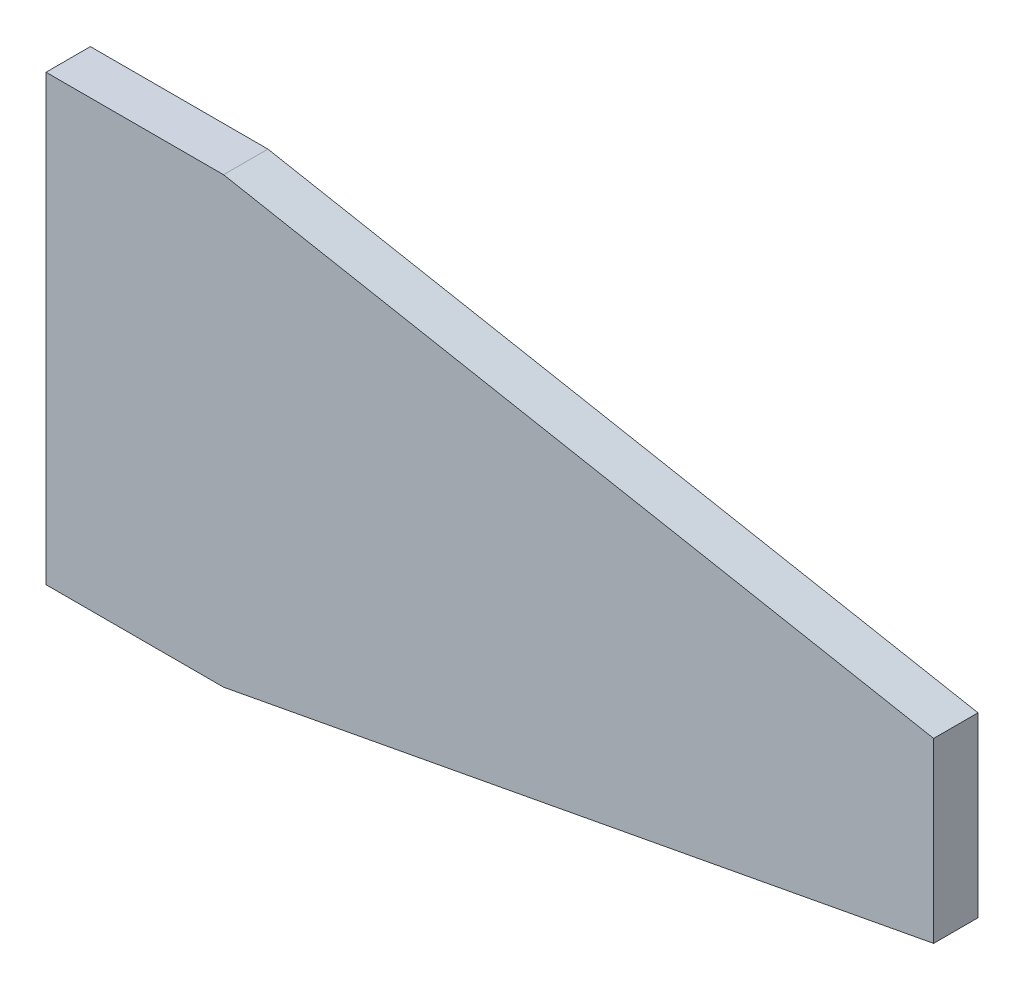
ISO-10303-21;
HEADER;
FILE_DESCRIPTION(('STEP AP214'),'2;1');
FILE_NAME('part.step','',(''),(''),'','','');
FILE_SCHEMA(('AUTOMOTIVE_DESIGN { 1 0 10303 214 1 1 1 1 }'));
ENDSEC;
DATA;
#1=APPLICATION_CONTEXT('core data for automotive mechanical design processes');
#2=APPLICATION_PROTOCOL_DEFINITION('international standard','automotive_design',2000,#1);
#3=PRODUCT_CONTEXT('',#1,'mechanical');
#4=PRODUCT('Part','Part','',(#3));
#5=PRODUCT_RELATED_PRODUCT_CATEGORY('part','',(#4));
#6=PRODUCT_DEFINITION_FORMATION('','',#4);
#7=PRODUCT_DEFINITION_CONTEXT('part definition',#1,'design');
#8=PRODUCT_DEFINITION('design','',#6,#7);
#9=PRODUCT_DEFINITION_SHAPE('','',#8);
#10=(LENGTH_UNIT() NAMED_UNIT(*) SI_UNIT(.MILLI.,.METRE.));
#11=(NAMED_UNIT(*) PLANE_ANGLE_UNIT() SI_UNIT($,.RADIAN.));
#12=(NAMED_UNIT(*) SI_UNIT($,.STERADIAN.) SOLID_ANGLE_UNIT());
#13=UNCERTAINTY_MEASURE_WITH_UNIT(LENGTH_MEASURE(1.E-05),#10,'distance_accuracy_value','');
#14=(GEOMETRIC_REPRESENTATION_CONTEXT(3) GLOBAL_UNCERTAINTY_ASSIGNED_CONTEXT((#13)) GLOBAL_UNIT_ASSIGNED_CONTEXT((#10,
#11,#12)) REPRESENTATION_CONTEXT('',''));
#15=CARTESIAN_POINT('',(0.,0.,0.));
#16=DIRECTION('',(0.,0.,1.));
#17=DIRECTION('',(1.,0.,0.));
#18=AXIS2_PLACEMENT_3D('',#15,#16,#17);
#19=CARTESIAN_POINT('',(200.,-20.,5.));
#20=DIRECTION('',(-1.,0.,0.));
#21=DIRECTION('',(0.,0.,1.));
#22=AXIS2_PLACEMENT_3D('',#19,#20,#21);
#23=PLANE('',#22);
#24=DIRECTION('',(0.,1.,0.));
#25=VECTOR('',#24,1.);
#26=CARTESIAN_POINT('',(200.,-20.,-5.));
#27=LINE('',#26,#25);
#28=CARTESIAN_POINT('',(200.,-20.,-5.));
#29=VERTEX_POINT('',#28);
#30=CARTESIAN_POINT('',(200.,20.,-5.));
#31=VERTEX_POINT('',#30);
#32=EDGE_CURVE('E121',#29,#31,#27,.T.);
#33=ORIENTED_EDGE('',*,*,#32,.T.);
#34=DIRECTION('',(0.,0.,-1.));
#35=VECTOR('',#34,1.);
#36=CARTESIAN_POINT('',(200.,20.,5.));
#37=LINE('',#36,#35);
#38=CARTESIAN_POINT('',(200.,20.,5.));
#39=VERTEX_POINT('',#38);
#40=EDGE_CURVE('E11',#39,#31,#37,.T.);
#41=ORIENTED_EDGE('',*,*,#40,.F.);
#42=DIRECTION('',(0.,1.,0.));
#43=VECTOR('',#42,1.);
#44=CARTESIAN_POINT('',(200.,-20.,5.));
#45=LINE('',#44,#43);
#46=CARTESIAN_POINT('',(200.,-20.,5.));
#47=VERTEX_POINT('',#46);
#48=EDGE_CURVE('E131',#47,#39,#45,.T.);
#49=ORIENTED_EDGE('',*,*,#48,.F.);
#50=DIRECTION('',(0.,0.,-1.));
#51=VECTOR('',#50,1.);
#52=CARTESIAN_POINT('',(200.,-20.,5.));
#53=LINE('',#52,#51);
#54=EDGE_CURVE('E117',#47,#29,#53,.T.);
#55=ORIENTED_EDGE('',*,*,#54,.T.);
#56=EDGE_LOOP('',(#33,#41,#49,#55));
#57=FACE_BOUND('',#56,.T.);
#58=ADVANCED_FACE('F37',(#57),#23,.F.);
#59=CARTESIAN_POINT('',(200.,20.,5.));
#60=DIRECTION('',(-0.184288535050185,-0.982872186934322,0.));
#61=DIRECTION('',(0.982872186934322,-0.184288535050185,0.));
#62=AXIS2_PLACEMENT_3D('',#59,#60,#61);
#63=PLANE('',#62);
#64=DIRECTION('',(-0.982872186934322,0.184288535050185,0.));
#65=VECTOR('',#64,1.);
#66=CARTESIAN_POINT('',(200.,20.,-5.));
#67=LINE('',#66,#65);
#68=CARTESIAN_POINT('',(40.,50.,-5.));
#69=VERTEX_POINT('',#68);
#70=EDGE_CURVE('E124',#31,#69,#67,.T.);
#71=ORIENTED_EDGE('',*,*,#70,.T.);
#72=DIRECTION('',(0.,0.,-1.));
#73=VECTOR('',#72,1.);
#74=CARTESIAN_POINT('',(40.,50.,5.));
#75=LINE('',#74,#73);
#76=CARTESIAN_POINT('',(40.,50.,5.));
#77=VERTEX_POINT('',#76);
#78=EDGE_CURVE('E45',#77,#69,#75,.T.);
#79=ORIENTED_EDGE('',*,*,#78,.F.);
#80=DIRECTION('',(-0.982872186934322,0.184288535050185,0.));
#81=VECTOR('',#80,1.);
#82=CARTESIAN_POINT('',(200.,20.,5.));
#83=LINE('',#82,#81);
#84=EDGE_CURVE('E90',#39,#77,#83,.T.);
#85=ORIENTED_EDGE('',*,*,#84,.F.);
#86=ORIENTED_EDGE('',*,*,#40,.T.);
#87=EDGE_LOOP('',(#71,#79,#85,#86));
#88=FACE_BOUND('',#87,.T.);
#89=ADVANCED_FACE('F155',(#88),#63,.F.);
#90=CARTESIAN_POINT('',(40.,50.,5.));
#91=DIRECTION('',(0.,-1.,0.));
#92=DIRECTION('',(1.,0.,0.));
#93=AXIS2_PLACEMENT_3D('',#90,#91,#92);
#94=PLANE('',#93);
#95=DIRECTION('',(-1.,0.,0.));
#96=VECTOR('',#95,1.);
#97=CARTESIAN_POINT('',(40.,50.,-5.));
#98=LINE('',#97,#96);
#99=CARTESIAN_POINT('',(0.,50.,-5.));
#100=VERTEX_POINT('',#99);
#101=EDGE_CURVE('E126',#69,#100,#98,.T.);
#102=ORIENTED_EDGE('',*,*,#101,.T.);
#103=DIRECTION('',(0.,0.,-1.));
#104=VECTOR('',#103,1.);
#105=CARTESIAN_POINT('',(0.,50.,5.));
#106=LINE('',#105,#104);
#107=CARTESIAN_POINT('',(0.,50.,5.));
#108=VERTEX_POINT('',#107);
#109=EDGE_CURVE('E112',#108,#100,#106,.T.);
#110=ORIENTED_EDGE('',*,*,#109,.F.);
#111=DIRECTION('',(-1.,0.,0.));
#112=VECTOR('',#111,1.);
#113=CARTESIAN_POINT('',(40.,50.,5.));
#114=LINE('',#113,#112);
#115=EDGE_CURVE('E103',#77,#108,#114,.T.);
#116=ORIENTED_EDGE('',*,*,#115,.F.);
#117=ORIENTED_EDGE('',*,*,#78,.T.);
#118=EDGE_LOOP('',(#102,#110,#116,#117));
#119=FACE_BOUND('',#118,.T.);
#120=ADVANCED_FACE('F137',(#119),#94,.F.);
#121=CARTESIAN_POINT('',(0.,50.,5.));
#122=DIRECTION('',(1.,0.,0.));
#123=DIRECTION('',(0.,0.,-1.));
#124=AXIS2_PLACEMENT_3D('',#121,#122,#123);
#125=PLANE('',#124);
#126=DIRECTION('',(0.,-1.,0.));
#127=VECTOR('',#126,1.);
#128=CARTESIAN_POINT('',(0.,50.,-5.));
#129=LINE('',#128,#127);
#130=CARTESIAN_POINT('',(0.,-50.,-5.));
#131=VERTEX_POINT('',#130);
#132=EDGE_CURVE('E111',#100,#131,#129,.T.);
#133=ORIENTED_EDGE('',*,*,#132,.T.);
#134=DIRECTION('',(0.,0.,-1.));
#135=VECTOR('',#134,1.);
#136=CARTESIAN_POINT('',(0.,-50.,5.));
#137=LINE('',#136,#135);
#138=CARTESIAN_POINT('',(0.,-50.,5.));
#139=VERTEX_POINT('',#138);
#140=EDGE_CURVE('E108',#139,#131,#137,.T.);
#141=ORIENTED_EDGE('',*,*,#140,.F.);
#142=DIRECTION('',(0.,-1.,0.));
#143=VECTOR('',#142,1.);
#144=CARTESIAN_POINT('',(0.,50.,5.));
#145=LINE('',#144,#143);
#146=EDGE_CURVE('E97',#108,#139,#145,.T.);
#147=ORIENTED_EDGE('',*,*,#146,.F.);
#148=ORIENTED_EDGE('',*,*,#109,.T.);
#149=EDGE_LOOP('',(#133,#141,#147,#148));
#150=FACE_BOUND('',#149,.T.);
#151=ADVANCED_FACE('F109',(#150),#125,.F.);
#152=CARTESIAN_POINT('',(0.,-50.,5.));
#153=DIRECTION('',(0.,1.,0.));
#154=DIRECTION('',(-1.,0.,0.));
#155=AXIS2_PLACEMENT_3D('',#152,#153,#154);
#156=PLANE('',#155);
#157=DIRECTION('',(1.,0.,0.));
#158=VECTOR('',#157,1.);
#159=CARTESIAN_POINT('',(0.,-50.,-5.));
#160=LINE('',#159,#158);
#161=CARTESIAN_POINT('',(40.,-50.,-5.));
#162=VERTEX_POINT('',#161);
#163=EDGE_CURVE('E76',#131,#162,#160,.T.);
#164=ORIENTED_EDGE('',*,*,#163,.T.);
#165=DIRECTION('',(0.,0.,-1.));
#166=VECTOR('',#165,1.);
#167=CARTESIAN_POINT('',(40.,-50.,5.));
#168=LINE('',#167,#166);
#169=CARTESIAN_POINT('',(40.,-50.,5.));
#170=VERTEX_POINT('',#169);
#171=EDGE_CURVE('E113',#170,#162,#168,.T.);
#172=ORIENTED_EDGE('',*,*,#171,.F.);
#173=DIRECTION('',(1.,0.,0.));
#174=VECTOR('',#173,1.);
#175=CARTESIAN_POINT('',(0.,-50.,5.));
#176=LINE('',#175,#174);
#177=EDGE_CURVE('E101',#139,#170,#176,.T.);
#178=ORIENTED_EDGE('',*,*,#177,.F.);
#179=ORIENTED_EDGE('',*,*,#140,.T.);
#180=EDGE_LOOP('',(#164,#172,#178,#179));
#181=FACE_BOUND('',#180,.T.);
#182=ADVANCED_FACE('F115',(#181),#156,.F.);
#183=CARTESIAN_POINT('',(40.,-50.,5.));
#184=DIRECTION('',(-0.184288535050185,0.982872186934322,0.));
#185=DIRECTION('',(-0.982872186934322,-0.184288535050185,0.));
#186=AXIS2_PLACEMENT_3D('',#183,#184,#185);
#187=PLANE('',#186);
#188=DIRECTION('',(0.982872186934322,0.184288535050185,0.));
#189=VECTOR('',#188,1.);
#190=CARTESIAN_POINT('',(40.,-50.,-5.));
#191=LINE('',#190,#189);
#192=EDGE_CURVE('E82',#162,#29,#191,.T.);
#193=ORIENTED_EDGE('',*,*,#192,.T.);
#194=ORIENTED_EDGE('',*,*,#54,.F.);
#195=DIRECTION('',(0.982872186934322,0.184288535050185,0.));
#196=VECTOR('',#195,1.);
#197=CARTESIAN_POINT('',(40.,-50.,5.));
#198=LINE('',#197,#196);
#199=EDGE_CURVE('E53',#170,#47,#198,.T.);
#200=ORIENTED_EDGE('',*,*,#199,.F.);
#201=ORIENTED_EDGE('',*,*,#171,.T.);
#202=EDGE_LOOP('',(#193,#194,#200,#201));
#203=FACE_BOUND('',#202,.T.);
#204=ADVANCED_FACE('F144',(#203),#187,.F.);
#205=CARTESIAN_POINT('',(0.,0.,5.));
#206=DIRECTION('',(0.,0.,1.));
#207=DIRECTION('',(1.,0.,0.));
#208=AXIS2_PLACEMENT_3D('',#205,#206,#207);
#209=PLANE('',#208);
#210=ORIENTED_EDGE('',*,*,#48,.T.);
#211=ORIENTED_EDGE('',*,*,#84,.T.);
#212=ORIENTED_EDGE('',*,*,#115,.T.);
#213=ORIENTED_EDGE('',*,*,#146,.T.);
#214=ORIENTED_EDGE('',*,*,#177,.T.);
#215=ORIENTED_EDGE('',*,*,#199,.T.);
#216=EDGE_LOOP('',(#210,#211,#212,#213,#214,#215));
#217=FACE_BOUND('',#216,.T.);
#218=ADVANCED_FACE('F99',(#217),#209,.T.);
#219=CARTESIAN_POINT('',(0.,0.,-5.));
#220=DIRECTION('',(0.,0.,1.));
#221=DIRECTION('',(1.,0.,0.));
#222=AXIS2_PLACEMENT_3D('',#219,#220,#221);
#223=PLANE('',#222);
#224=ORIENTED_EDGE('',*,*,#32,.F.);
#225=ORIENTED_EDGE('',*,*,#192,.F.);
#226=ORIENTED_EDGE('',*,*,#163,.F.);
#227=ORIENTED_EDGE('',*,*,#132,.F.);
#228=ORIENTED_EDGE('',*,*,#101,.F.);
#229=ORIENTED_EDGE('',*,*,#70,.F.);
#230=EDGE_LOOP('',(#224,#225,#226,#227,#228,#229));
#231=FACE_BOUND('',#230,.T.);
#232=ADVANCED_FACE('F140',(#231),#223,.F.);
#233=CLOSED_SHELL('',(#58,#89,#120,#151,#182,#204,#218,#232));
#234=MANIFOLD_SOLID_BREP('B2',#233);
#235=ADVANCED_BREP_SHAPE_REPRESENTATION('',(#18,#234),#14);
#236=SHAPE_DEFINITION_REPRESENTATION(#9,#235);
ENDSEC;
END-ISO-10303-21;
